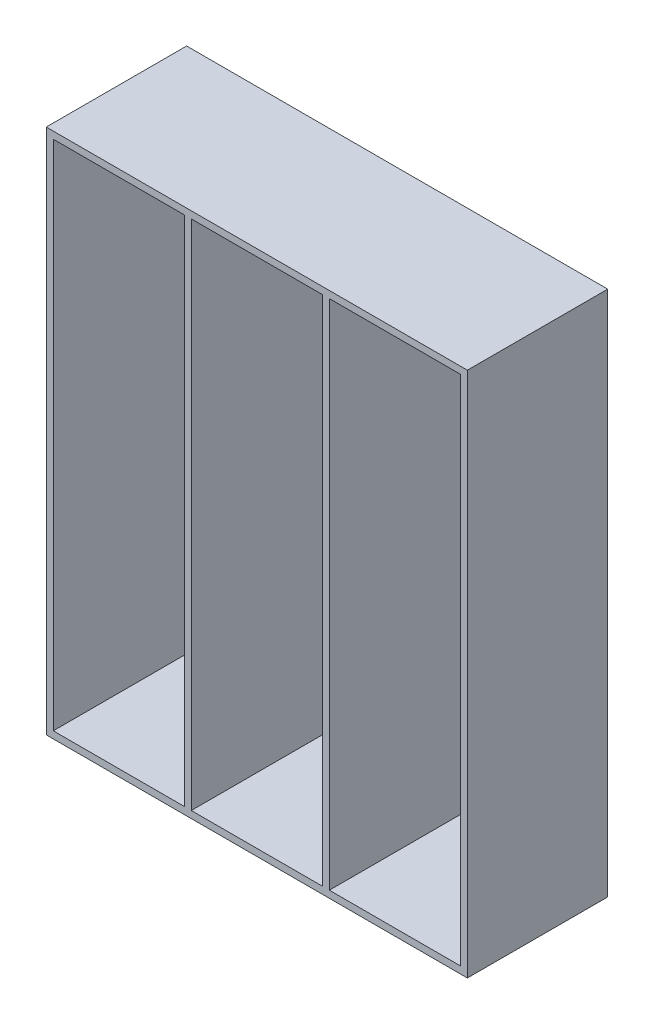
ISO-10303-21;
HEADER;
FILE_DESCRIPTION(('STEP AP214'),'2;1');
FILE_NAME('part.step','',(''),(''),'','','');
FILE_SCHEMA(('AUTOMOTIVE_DESIGN { 1 0 10303 214 1 1 1 1 }'));
ENDSEC;
DATA;
#1=APPLICATION_CONTEXT('core data for automotive mechanical design processes');
#2=APPLICATION_PROTOCOL_DEFINITION('international standard','automotive_design',2000,#1);
#3=PRODUCT_CONTEXT('',#1,'mechanical');
#4=PRODUCT('Part','Part','',(#3));
#5=PRODUCT_RELATED_PRODUCT_CATEGORY('part','',(#4));
#6=PRODUCT_DEFINITION_FORMATION('','',#4);
#7=PRODUCT_DEFINITION_CONTEXT('part definition',#1,'design');
#8=PRODUCT_DEFINITION('design','',#6,#7);
#9=PRODUCT_DEFINITION_SHAPE('','',#8);
#10=(LENGTH_UNIT() NAMED_UNIT(*) SI_UNIT(.MILLI.,.METRE.));
#11=(NAMED_UNIT(*) PLANE_ANGLE_UNIT() SI_UNIT($,.RADIAN.));
#12=(NAMED_UNIT(*) SI_UNIT($,.STERADIAN.) SOLID_ANGLE_UNIT());
#13=UNCERTAINTY_MEASURE_WITH_UNIT(LENGTH_MEASURE(1.E-05),#10,'distance_accuracy_value','');
#14=(GEOMETRIC_REPRESENTATION_CONTEXT(3) GLOBAL_UNCERTAINTY_ASSIGNED_CONTEXT((#13)) GLOBAL_UNIT_ASSIGNED_CONTEXT((#10,
#11,#12)) REPRESENTATION_CONTEXT('',''));
#15=CARTESIAN_POINT('',(0.,0.,0.));
#16=DIRECTION('',(0.,0.,1.));
#17=DIRECTION('',(1.,0.,0.));
#18=AXIS2_PLACEMENT_3D('',#15,#16,#17);
#19=CARTESIAN_POINT('',(30.,-37.5,-20.));
#20=DIRECTION('',(1.,0.,0.));
#21=DIRECTION('',(0.,0.,-1.));
#22=AXIS2_PLACEMENT_3D('',#19,#20,#21);
#23=PLANE('',#22);
#24=DIRECTION('',(0.,1.,0.));
#25=VECTOR('',#24,1.);
#26=CARTESIAN_POINT('',(30.,-37.5,0.));
#27=LINE('',#26,#25);
#28=CARTESIAN_POINT('',(30.,-37.5,0.));
#29=VERTEX_POINT('',#28);
#30=CARTESIAN_POINT('',(30.,37.5,0.));
#31=VERTEX_POINT('',#30);
#32=EDGE_CURVE('E246',#29,#31,#27,.T.);
#33=ORIENTED_EDGE('',*,*,#32,.F.);
#34=DIRECTION('',(0.,0.,1.));
#35=VECTOR('',#34,1.);
#36=CARTESIAN_POINT('',(30.,-37.5,-20.));
#37=LINE('',#36,#35);
#38=CARTESIAN_POINT('',(30.,-37.5,-20.));
#39=VERTEX_POINT('',#38);
#40=EDGE_CURVE('E11',#39,#29,#37,.T.);
#41=ORIENTED_EDGE('',*,*,#40,.F.);
#42=DIRECTION('',(0.,1.,0.));
#43=VECTOR('',#42,1.);
#44=CARTESIAN_POINT('',(30.,-37.5,-20.));
#45=LINE('',#44,#43);
#46=CARTESIAN_POINT('',(30.,37.5,-20.));
#47=VERTEX_POINT('',#46);
#48=EDGE_CURVE('E251',#39,#47,#45,.T.);
#49=ORIENTED_EDGE('',*,*,#48,.T.);
#50=DIRECTION('',(0.,0.,1.));
#51=VECTOR('',#50,1.);
#52=CARTESIAN_POINT('',(30.,37.5,-20.));
#53=LINE('',#52,#51);
#54=EDGE_CURVE('E45',#47,#31,#53,.T.);
#55=ORIENTED_EDGE('',*,*,#54,.T.);
#56=EDGE_LOOP('',(#33,#41,#49,#55));
#57=FACE_BOUND('',#56,.T.);
#58=ADVANCED_FACE('F39',(#57),#23,.T.);
#59=CARTESIAN_POINT('',(-30.,-37.5,-20.));
#60=DIRECTION('',(0.,-1.,0.));
#61=DIRECTION('',(0.,0.,-1.));
#62=AXIS2_PLACEMENT_3D('',#59,#60,#61);
#63=PLANE('',#62);
#64=DIRECTION('',(1.,0.,0.));
#65=VECTOR('',#64,1.);
#66=CARTESIAN_POINT('',(-30.,-37.5,0.));
#67=LINE('',#66,#65);
#68=CARTESIAN_POINT('',(-30.,-37.5,0.));
#69=VERTEX_POINT('',#68);
#70=EDGE_CURVE('E260',#69,#29,#67,.T.);
#71=ORIENTED_EDGE('',*,*,#70,.F.);
#72=DIRECTION('',(0.,0.,1.));
#73=VECTOR('',#72,1.);
#74=CARTESIAN_POINT('',(-30.,-37.5,-20.));
#75=LINE('',#74,#73);
#76=CARTESIAN_POINT('',(-30.,-37.5,-20.));
#77=VERTEX_POINT('',#76);
#78=EDGE_CURVE('E50',#77,#69,#75,.T.);
#79=ORIENTED_EDGE('',*,*,#78,.F.);
#80=DIRECTION('',(1.,0.,0.));
#81=VECTOR('',#80,1.);
#82=CARTESIAN_POINT('',(-30.,-37.5,-20.));
#83=LINE('',#82,#81);
#84=EDGE_CURVE('E263',#77,#39,#83,.T.);
#85=ORIENTED_EDGE('',*,*,#84,.T.);
#86=ORIENTED_EDGE('',*,*,#40,.T.);
#87=EDGE_LOOP('',(#71,#79,#85,#86));
#88=FACE_BOUND('',#87,.T.);
#89=ADVANCED_FACE('F288',(#88),#63,.T.);
#90=CARTESIAN_POINT('',(-30.,-37.5,-20.));
#91=DIRECTION('',(-1.,0.,0.));
#92=DIRECTION('',(0.,0.,1.));
#93=AXIS2_PLACEMENT_3D('',#90,#91,#92);
#94=PLANE('',#93);
#95=DIRECTION('',(0.,-1.,0.));
#96=VECTOR('',#95,1.);
#97=CARTESIAN_POINT('',(-30.,-37.5,0.));
#98=LINE('',#97,#96);
#99=CARTESIAN_POINT('',(-30.,37.5,0.));
#100=VERTEX_POINT('',#99);
#101=EDGE_CURVE('E271',#100,#69,#98,.T.);
#102=ORIENTED_EDGE('',*,*,#101,.F.);
#103=DIRECTION('',(0.,0.,1.));
#104=VECTOR('',#103,1.);
#105=CARTESIAN_POINT('',(-30.,37.5,-20.));
#106=LINE('',#105,#104);
#107=CARTESIAN_POINT('',(-30.,37.5,-20.));
#108=VERTEX_POINT('',#107);
#109=EDGE_CURVE('E277',#108,#100,#106,.T.);
#110=ORIENTED_EDGE('',*,*,#109,.F.);
#111=DIRECTION('',(0.,-1.,0.));
#112=VECTOR('',#111,1.);
#113=CARTESIAN_POINT('',(-30.,-37.5,-20.));
#114=LINE('',#113,#112);
#115=EDGE_CURVE('E257',#108,#77,#114,.T.);
#116=ORIENTED_EDGE('',*,*,#115,.T.);
#117=ORIENTED_EDGE('',*,*,#78,.T.);
#118=EDGE_LOOP('',(#102,#110,#116,#117));
#119=FACE_BOUND('',#118,.T.);
#120=ADVANCED_FACE('F293',(#119),#94,.T.);
#121=CARTESIAN_POINT('',(-30.,37.5,-20.));
#122=DIRECTION('',(0.,1.,0.));
#123=DIRECTION('',(0.,0.,1.));
#124=AXIS2_PLACEMENT_3D('',#121,#122,#123);
#125=PLANE('',#124);
#126=DIRECTION('',(-1.,0.,0.));
#127=VECTOR('',#126,1.);
#128=CARTESIAN_POINT('',(-30.,37.5,0.));
#129=LINE('',#128,#127);
#130=EDGE_CURVE('E268',#31,#100,#129,.T.);
#131=ORIENTED_EDGE('',*,*,#130,.F.);
#132=ORIENTED_EDGE('',*,*,#54,.F.);
#133=DIRECTION('',(-1.,0.,0.));
#134=VECTOR('',#133,1.);
#135=CARTESIAN_POINT('',(-30.,37.5,-20.));
#136=LINE('',#135,#134);
#137=EDGE_CURVE('E258',#47,#108,#136,.T.);
#138=ORIENTED_EDGE('',*,*,#137,.T.);
#139=ORIENTED_EDGE('',*,*,#109,.T.);
#140=EDGE_LOOP('',(#131,#132,#138,#139));
#141=FACE_BOUND('',#140,.T.);
#142=ADVANCED_FACE('F283',(#141),#125,.T.);
#143=CARTESIAN_POINT('',(0.,0.,-20.));
#144=DIRECTION('',(0.,0.,-1.));
#145=DIRECTION('',(-1.,0.,0.));
#146=AXIS2_PLACEMENT_3D('',#143,#144,#145);
#147=PLANE('',#146);
#148=ORIENTED_EDGE('',*,*,#48,.F.);
#149=ORIENTED_EDGE('',*,*,#84,.F.);
#150=ORIENTED_EDGE('',*,*,#115,.F.);
#151=ORIENTED_EDGE('',*,*,#137,.F.);
#152=EDGE_LOOP('',(#148,#149,#150,#151));
#153=FACE_BOUND('',#152,.T.);
#154=ADVANCED_FACE('F295',(#153),#147,.T.);
#155=CARTESIAN_POINT('',(0.,0.,0.));
#156=DIRECTION('',(0.,0.,-1.));
#157=DIRECTION('',(-1.,0.,0.));
#158=AXIS2_PLACEMENT_3D('',#155,#156,#157);
#159=PLANE('',#158);
#160=DIRECTION('',(-1.,0.,0.));
#161=VECTOR('',#160,1.);
#162=CARTESIAN_POINT('',(10.3333333333333,36.5,0.));
#163=LINE('',#162,#161);
#164=CARTESIAN_POINT('',(29.,36.5,0.));
#165=VERTEX_POINT('',#164);
#166=CARTESIAN_POINT('',(10.3333333333333,36.5,0.));
#167=VERTEX_POINT('',#166);
#168=EDGE_CURVE('E182',#165,#167,#163,.T.);
#169=ORIENTED_EDGE('',*,*,#168,.F.);
#170=DIRECTION('',(0.,1.,0.));
#171=VECTOR('',#170,1.);
#172=CARTESIAN_POINT('',(29.,-36.5,0.));
#173=LINE('',#172,#171);
#174=CARTESIAN_POINT('',(29.,-36.5,0.));
#175=VERTEX_POINT('',#174);
#176=EDGE_CURVE('E54',#175,#165,#173,.T.);
#177=ORIENTED_EDGE('',*,*,#176,.F.);
#178=DIRECTION('',(1.,0.,0.));
#179=VECTOR('',#178,1.);
#180=CARTESIAN_POINT('',(10.3333333333333,-36.5,0.));
#181=LINE('',#180,#179);
#182=CARTESIAN_POINT('',(10.3333333333333,-36.5,0.));
#183=VERTEX_POINT('',#182);
#184=EDGE_CURVE('E171',#183,#175,#181,.T.);
#185=ORIENTED_EDGE('',*,*,#184,.F.);
#186=DIRECTION('',(0.,-1.,0.));
#187=VECTOR('',#186,1.);
#188=CARTESIAN_POINT('',(10.3333333333333,-36.5,0.));
#189=LINE('',#188,#187);
#190=EDGE_CURVE('E172',#167,#183,#189,.T.);
#191=ORIENTED_EDGE('',*,*,#190,.F.);
#192=EDGE_LOOP('',(#169,#177,#185,#191));
#193=FACE_BOUND('',#192,.T.);
#194=DIRECTION('',(-1.,0.,0.));
#195=VECTOR('',#194,1.);
#196=CARTESIAN_POINT('',(-9.33333333333333,36.5,0.));
#197=LINE('',#196,#195);
#198=CARTESIAN_POINT('',(9.33333333333333,36.5,0.));
#199=VERTEX_POINT('',#198);
#200=CARTESIAN_POINT('',(-9.33333333333333,36.5,0.));
#201=VERTEX_POINT('',#200);
#202=EDGE_CURVE('E202',#199,#201,#197,.T.);
#203=ORIENTED_EDGE('',*,*,#202,.F.);
#204=DIRECTION('',(0.,1.,0.));
#205=VECTOR('',#204,1.);
#206=CARTESIAN_POINT('',(9.33333333333333,-36.5,0.));
#207=LINE('',#206,#205);
#208=CARTESIAN_POINT('',(9.33333333333333,-36.5,0.));
#209=VERTEX_POINT('',#208);
#210=EDGE_CURVE('E65',#209,#199,#207,.T.);
#211=ORIENTED_EDGE('',*,*,#210,.F.);
#212=DIRECTION('',(1.,0.,0.));
#213=VECTOR('',#212,1.);
#214=CARTESIAN_POINT('',(-9.33333333333333,-36.5,0.));
#215=LINE('',#214,#213);
#216=CARTESIAN_POINT('',(-9.33333333333333,-36.5,0.));
#217=VERTEX_POINT('',#216);
#218=EDGE_CURVE('E193',#217,#209,#215,.T.);
#219=ORIENTED_EDGE('',*,*,#218,.F.);
#220=DIRECTION('',(0.,-1.,0.));
#221=VECTOR('',#220,1.);
#222=CARTESIAN_POINT('',(-9.33333333333333,-36.5,0.));
#223=LINE('',#222,#221);
#224=EDGE_CURVE('E208',#201,#217,#223,.T.);
#225=ORIENTED_EDGE('',*,*,#224,.F.);
#226=EDGE_LOOP('',(#203,#211,#219,#225));
#227=FACE_BOUND('',#226,.T.);
#228=DIRECTION('',(-1.,0.,0.));
#229=VECTOR('',#228,1.);
#230=CARTESIAN_POINT('',(-29.,36.5,0.));
#231=LINE('',#230,#229);
#232=CARTESIAN_POINT('',(-10.3333333333333,36.5,0.));
#233=VERTEX_POINT('',#232);
#234=CARTESIAN_POINT('',(-29.,36.5,0.));
#235=VERTEX_POINT('',#234);
#236=EDGE_CURVE('E237',#233,#235,#231,.T.);
#237=ORIENTED_EDGE('',*,*,#236,.F.);
#238=DIRECTION('',(0.,1.,0.));
#239=VECTOR('',#238,1.);
#240=CARTESIAN_POINT('',(-10.3333333333333,-36.5,0.));
#241=LINE('',#240,#239);
#242=CARTESIAN_POINT('',(-10.3333333333333,-36.5,0.));
#243=VERTEX_POINT('',#242);
#244=EDGE_CURVE('E214',#243,#233,#241,.T.);
#245=ORIENTED_EDGE('',*,*,#244,.F.);
#246=DIRECTION('',(1.,0.,0.));
#247=VECTOR('',#246,1.);
#248=CARTESIAN_POINT('',(-29.,-36.5,0.));
#249=LINE('',#248,#247);
#250=CARTESIAN_POINT('',(-29.,-36.5,0.));
#251=VERTEX_POINT('',#250);
#252=EDGE_CURVE('E223',#251,#243,#249,.T.);
#253=ORIENTED_EDGE('',*,*,#252,.F.);
#254=DIRECTION('',(0.,-1.,0.));
#255=VECTOR('',#254,1.);
#256=CARTESIAN_POINT('',(-29.,-36.5,0.));
#257=LINE('',#256,#255);
#258=EDGE_CURVE('E239',#235,#251,#257,.T.);
#259=ORIENTED_EDGE('',*,*,#258,.F.);
#260=EDGE_LOOP('',(#237,#245,#253,#259));
#261=FACE_BOUND('',#260,.T.);
#262=ORIENTED_EDGE('',*,*,#32,.T.);
#263=ORIENTED_EDGE('',*,*,#130,.T.);
#264=ORIENTED_EDGE('',*,*,#101,.T.);
#265=ORIENTED_EDGE('',*,*,#70,.T.);
#266=EDGE_LOOP('',(#262,#263,#264,#265));
#267=FACE_BOUND('',#266,.T.);
#268=ADVANCED_FACE('F286',(#193,#227,#261,#267),#159,.F.);
#269=CARTESIAN_POINT('',(-10.3333333333333,-36.5,-19.));
#270=DIRECTION('',(1.,0.,0.));
#271=DIRECTION('',(0.,0.,-1.));
#272=AXIS2_PLACEMENT_3D('',#269,#270,#271);
#273=PLANE('',#272);
#274=ORIENTED_EDGE('',*,*,#244,.T.);
#275=DIRECTION('',(0.,0.,1.));
#276=VECTOR('',#275,1.);
#277=CARTESIAN_POINT('',(-10.3333333333333,36.5,-19.));
#278=LINE('',#277,#276);
#279=CARTESIAN_POINT('',(-10.3333333333333,36.5,-19.));
#280=VERTEX_POINT('',#279);
#281=EDGE_CURVE('E233',#280,#233,#278,.T.);
#282=ORIENTED_EDGE('',*,*,#281,.F.);
#283=DIRECTION('',(0.,1.,0.));
#284=VECTOR('',#283,1.);
#285=CARTESIAN_POINT('',(-10.3333333333333,-36.5,-19.));
#286=LINE('',#285,#284);
#287=CARTESIAN_POINT('',(-10.3333333333333,-36.5,-19.));
#288=VERTEX_POINT('',#287);
#289=EDGE_CURVE('E222',#288,#280,#286,.T.);
#290=ORIENTED_EDGE('',*,*,#289,.F.);
#291=DIRECTION('',(0.,0.,1.));
#292=VECTOR('',#291,1.);
#293=CARTESIAN_POINT('',(-10.3333333333333,-36.5,-19.));
#294=LINE('',#293,#292);
#295=EDGE_CURVE('E243',#288,#243,#294,.T.);
#296=ORIENTED_EDGE('',*,*,#295,.T.);
#297=EDGE_LOOP('',(#274,#282,#290,#296));
#298=FACE_BOUND('',#297,.T.);
#299=ADVANCED_FACE('F337',(#298),#273,.F.);
#300=CARTESIAN_POINT('',(-29.,-36.5,-19.));
#301=DIRECTION('',(0.,-1.,0.));
#302=DIRECTION('',(0.,0.,-1.));
#303=AXIS2_PLACEMENT_3D('',#300,#301,#302);
#304=PLANE('',#303);
#305=ORIENTED_EDGE('',*,*,#252,.T.);
#306=ORIENTED_EDGE('',*,*,#295,.F.);
#307=DIRECTION('',(1.,0.,0.));
#308=VECTOR('',#307,1.);
#309=CARTESIAN_POINT('',(-29.,-36.5,-19.));
#310=LINE('',#309,#308);
#311=CARTESIAN_POINT('',(-29.,-36.5,-19.));
#312=VERTEX_POINT('',#311);
#313=EDGE_CURVE('E231',#312,#288,#310,.T.);
#314=ORIENTED_EDGE('',*,*,#313,.F.);
#315=DIRECTION('',(0.,0.,1.));
#316=VECTOR('',#315,1.);
#317=CARTESIAN_POINT('',(-29.,-36.5,-19.));
#318=LINE('',#317,#316);
#319=EDGE_CURVE('E247',#312,#251,#318,.T.);
#320=ORIENTED_EDGE('',*,*,#319,.T.);
#321=EDGE_LOOP('',(#305,#306,#314,#320));
#322=FACE_BOUND('',#321,.T.);
#323=ADVANCED_FACE('F354',(#322),#304,.F.);
#324=CARTESIAN_POINT('',(-29.,-36.5,-19.));
#325=DIRECTION('',(-1.,0.,0.));
#326=DIRECTION('',(0.,0.,1.));
#327=AXIS2_PLACEMENT_3D('',#324,#325,#326);
#328=PLANE('',#327);
#329=ORIENTED_EDGE('',*,*,#258,.T.);
#330=ORIENTED_EDGE('',*,*,#319,.F.);
#331=DIRECTION('',(0.,-1.,0.));
#332=VECTOR('',#331,1.);
#333=CARTESIAN_POINT('',(-29.,-36.5,-19.));
#334=LINE('',#333,#332);
#335=CARTESIAN_POINT('',(-29.,36.5,-19.));
#336=VERTEX_POINT('',#335);
#337=EDGE_CURVE('E230',#336,#312,#334,.T.);
#338=ORIENTED_EDGE('',*,*,#337,.F.);
#339=DIRECTION('',(0.,0.,1.));
#340=VECTOR('',#339,1.);
#341=CARTESIAN_POINT('',(-29.,36.5,-19.));
#342=LINE('',#341,#340);
#343=EDGE_CURVE('E248',#336,#235,#342,.T.);
#344=ORIENTED_EDGE('',*,*,#343,.T.);
#345=EDGE_LOOP('',(#329,#330,#338,#344));
#346=FACE_BOUND('',#345,.T.);
#347=ADVANCED_FACE('F363',(#346),#328,.F.);
#348=CARTESIAN_POINT('',(-29.,36.5,-19.));
#349=DIRECTION('',(0.,1.,0.));
#350=DIRECTION('',(0.,0.,1.));
#351=AXIS2_PLACEMENT_3D('',#348,#349,#350);
#352=PLANE('',#351);
#353=ORIENTED_EDGE('',*,*,#236,.T.);
#354=ORIENTED_EDGE('',*,*,#343,.F.);
#355=DIRECTION('',(-1.,0.,0.));
#356=VECTOR('',#355,1.);
#357=CARTESIAN_POINT('',(-29.,36.5,-19.));
#358=LINE('',#357,#356);
#359=EDGE_CURVE('E221',#280,#336,#358,.T.);
#360=ORIENTED_EDGE('',*,*,#359,.F.);
#361=ORIENTED_EDGE('',*,*,#281,.T.);
#362=EDGE_LOOP('',(#353,#354,#360,#361));
#363=FACE_BOUND('',#362,.T.);
#364=ADVANCED_FACE('F371',(#363),#352,.F.);
#365=CARTESIAN_POINT('',(0.,0.,-19.));
#366=DIRECTION('',(0.,0.,-1.));
#367=DIRECTION('',(-1.,0.,0.));
#368=AXIS2_PLACEMENT_3D('',#365,#366,#367);
#369=PLANE('',#368);
#370=ORIENTED_EDGE('',*,*,#289,.T.);
#371=ORIENTED_EDGE('',*,*,#359,.T.);
#372=ORIENTED_EDGE('',*,*,#337,.T.);
#373=ORIENTED_EDGE('',*,*,#313,.T.);
#374=EDGE_LOOP('',(#370,#371,#372,#373));
#375=FACE_BOUND('',#374,.T.);
#376=ADVANCED_FACE('F381',(#375),#369,.F.);
#377=CARTESIAN_POINT('',(9.33333333333333,-36.5,-19.));
#378=DIRECTION('',(1.,0.,0.));
#379=DIRECTION('',(0.,0.,-1.));
#380=AXIS2_PLACEMENT_3D('',#377,#378,#379);
#381=PLANE('',#380);
#382=ORIENTED_EDGE('',*,*,#210,.T.);
#383=DIRECTION('',(0.,0.,1.));
#384=VECTOR('',#383,1.);
#385=CARTESIAN_POINT('',(9.33333333333333,36.5,-19.));
#386=LINE('',#385,#384);
#387=CARTESIAN_POINT('',(9.33333333333333,36.5,-19.));
#388=VERTEX_POINT('',#387);
#389=EDGE_CURVE('E201',#388,#199,#386,.T.);
#390=ORIENTED_EDGE('',*,*,#389,.F.);
#391=DIRECTION('',(0.,1.,0.));
#392=VECTOR('',#391,1.);
#393=CARTESIAN_POINT('',(9.33333333333333,-36.5,-19.));
#394=LINE('',#393,#392);
#395=CARTESIAN_POINT('',(9.33333333333333,-36.5,-19.));
#396=VERTEX_POINT('',#395);
#397=EDGE_CURVE('E187',#396,#388,#394,.T.);
#398=ORIENTED_EDGE('',*,*,#397,.F.);
#399=DIRECTION('',(0.,0.,1.));
#400=VECTOR('',#399,1.);
#401=CARTESIAN_POINT('',(9.33333333333333,-36.5,-19.));
#402=LINE('',#401,#400);
#403=EDGE_CURVE('E213',#396,#209,#402,.T.);
#404=ORIENTED_EDGE('',*,*,#403,.T.);
#405=EDGE_LOOP('',(#382,#390,#398,#404));
#406=FACE_BOUND('',#405,.T.);
#407=ADVANCED_FACE('F394',(#406),#381,.F.);
#408=CARTESIAN_POINT('',(-9.33333333333333,-36.5,-19.));
#409=DIRECTION('',(0.,-1.,0.));
#410=DIRECTION('',(0.,0.,-1.));
#411=AXIS2_PLACEMENT_3D('',#408,#409,#410);
#412=PLANE('',#411);
#413=ORIENTED_EDGE('',*,*,#218,.T.);
#414=ORIENTED_EDGE('',*,*,#403,.F.);
#415=DIRECTION('',(1.,0.,0.));
#416=VECTOR('',#415,1.);
#417=CARTESIAN_POINT('',(-9.33333333333333,-36.5,-19.));
#418=LINE('',#417,#416);
#419=CARTESIAN_POINT('',(-9.33333333333333,-36.5,-19.));
#420=VERTEX_POINT('',#419);
#421=EDGE_CURVE('E199',#420,#396,#418,.T.);
#422=ORIENTED_EDGE('',*,*,#421,.F.);
#423=DIRECTION('',(0.,0.,1.));
#424=VECTOR('',#423,1.);
#425=CARTESIAN_POINT('',(-9.33333333333333,-36.5,-19.));
#426=LINE('',#425,#424);
#427=EDGE_CURVE('E216',#420,#217,#426,.T.);
#428=ORIENTED_EDGE('',*,*,#427,.T.);
#429=EDGE_LOOP('',(#413,#414,#422,#428));
#430=FACE_BOUND('',#429,.T.);
#431=ADVANCED_FACE('F402',(#430),#412,.F.);
#432=CARTESIAN_POINT('',(-9.33333333333333,-36.5,-19.));
#433=DIRECTION('',(-1.,0.,0.));
#434=DIRECTION('',(0.,0.,1.));
#435=AXIS2_PLACEMENT_3D('',#432,#433,#434);
#436=PLANE('',#435);
#437=ORIENTED_EDGE('',*,*,#224,.T.);
#438=ORIENTED_EDGE('',*,*,#427,.F.);
#439=DIRECTION('',(0.,-1.,0.));
#440=VECTOR('',#439,1.);
#441=CARTESIAN_POINT('',(-9.33333333333333,-36.5,-19.));
#442=LINE('',#441,#440);
#443=CARTESIAN_POINT('',(-9.33333333333333,36.5,-19.));
#444=VERTEX_POINT('',#443);
#445=EDGE_CURVE('E197',#444,#420,#442,.T.);
#446=ORIENTED_EDGE('',*,*,#445,.F.);
#447=DIRECTION('',(0.,0.,1.));
#448=VECTOR('',#447,1.);
#449=CARTESIAN_POINT('',(-9.33333333333333,36.5,-19.));
#450=LINE('',#449,#448);
#451=EDGE_CURVE('E217',#444,#201,#450,.T.);
#452=ORIENTED_EDGE('',*,*,#451,.T.);
#453=EDGE_LOOP('',(#437,#438,#446,#452));
#454=FACE_BOUND('',#453,.T.);
#455=ADVANCED_FACE('F407',(#454),#436,.F.);
#456=CARTESIAN_POINT('',(-9.33333333333333,36.5,-19.));
#457=DIRECTION('',(0.,1.,0.));
#458=DIRECTION('',(0.,0.,1.));
#459=AXIS2_PLACEMENT_3D('',#456,#457,#458);
#460=PLANE('',#459);
#461=ORIENTED_EDGE('',*,*,#202,.T.);
#462=ORIENTED_EDGE('',*,*,#451,.F.);
#463=DIRECTION('',(-1.,0.,0.));
#464=VECTOR('',#463,1.);
#465=CARTESIAN_POINT('',(-9.33333333333333,36.5,-19.));
#466=LINE('',#465,#464);
#467=EDGE_CURVE('E194',#388,#444,#466,.T.);
#468=ORIENTED_EDGE('',*,*,#467,.F.);
#469=ORIENTED_EDGE('',*,*,#389,.T.);
#470=EDGE_LOOP('',(#461,#462,#468,#469));
#471=FACE_BOUND('',#470,.T.);
#472=ADVANCED_FACE('F419',(#471),#460,.F.);
#473=CARTESIAN_POINT('',(0.,0.,-19.));
#474=DIRECTION('',(0.,0.,-1.));
#475=DIRECTION('',(-1.,0.,0.));
#476=AXIS2_PLACEMENT_3D('',#473,#474,#475);
#477=PLANE('',#476);
#478=ORIENTED_EDGE('',*,*,#397,.T.);
#479=ORIENTED_EDGE('',*,*,#467,.T.);
#480=ORIENTED_EDGE('',*,*,#445,.T.);
#481=ORIENTED_EDGE('',*,*,#421,.T.);
#482=EDGE_LOOP('',(#478,#479,#480,#481));
#483=FACE_BOUND('',#482,.T.);
#484=ADVANCED_FACE('F429',(#483),#477,.F.);
#485=CARTESIAN_POINT('',(29.,-36.5,-19.));
#486=DIRECTION('',(1.,0.,0.));
#487=DIRECTION('',(0.,0.,-1.));
#488=AXIS2_PLACEMENT_3D('',#485,#486,#487);
#489=PLANE('',#488);
#490=ORIENTED_EDGE('',*,*,#176,.T.);
#491=DIRECTION('',(0.,0.,1.));
#492=VECTOR('',#491,1.);
#493=CARTESIAN_POINT('',(29.,36.5,-19.));
#494=LINE('',#493,#492);
#495=CARTESIAN_POINT('',(29.,36.5,-19.));
#496=VERTEX_POINT('',#495);
#497=EDGE_CURVE('E147',#496,#165,#494,.T.);
#498=ORIENTED_EDGE('',*,*,#497,.F.);
#499=DIRECTION('',(0.,1.,0.));
#500=VECTOR('',#499,1.);
#501=CARTESIAN_POINT('',(29.,-36.5,-19.));
#502=LINE('',#501,#500);
#503=CARTESIAN_POINT('',(29.,-36.5,-19.));
#504=VERTEX_POINT('',#503);
#505=EDGE_CURVE('E152',#504,#496,#502,.T.);
#506=ORIENTED_EDGE('',*,*,#505,.F.);
#507=DIRECTION('',(0.,0.,1.));
#508=VECTOR('',#507,1.);
#509=CARTESIAN_POINT('',(29.,-36.5,-19.));
#510=LINE('',#509,#508);
#511=EDGE_CURVE('E183',#504,#175,#510,.T.);
#512=ORIENTED_EDGE('',*,*,#511,.T.);
#513=EDGE_LOOP('',(#490,#498,#506,#512));
#514=FACE_BOUND('',#513,.T.);
#515=ADVANCED_FACE('F155',(#514),#489,.F.);
#516=CARTESIAN_POINT('',(10.3333333333333,-36.5,-19.));
#517=DIRECTION('',(0.,-1.,0.));
#518=DIRECTION('',(0.,0.,-1.));
#519=AXIS2_PLACEMENT_3D('',#516,#517,#518);
#520=PLANE('',#519);
#521=ORIENTED_EDGE('',*,*,#184,.T.);
#522=ORIENTED_EDGE('',*,*,#511,.F.);
#523=DIRECTION('',(1.,0.,0.));
#524=VECTOR('',#523,1.);
#525=CARTESIAN_POINT('',(10.3333333333333,-36.5,-19.));
#526=LINE('',#525,#524);
#527=CARTESIAN_POINT('',(10.3333333333333,-36.5,-19.));
#528=VERTEX_POINT('',#527);
#529=EDGE_CURVE('E159',#528,#504,#526,.T.);
#530=ORIENTED_EDGE('',*,*,#529,.F.);
#531=DIRECTION('',(0.,0.,1.));
#532=VECTOR('',#531,1.);
#533=CARTESIAN_POINT('',(10.3333333333333,-36.5,-19.));
#534=LINE('',#533,#532);
#535=EDGE_CURVE('E186',#528,#183,#534,.T.);
#536=ORIENTED_EDGE('',*,*,#535,.T.);
#537=EDGE_LOOP('',(#521,#522,#530,#536));
#538=FACE_BOUND('',#537,.T.);
#539=ADVANCED_FACE('F446',(#538),#520,.F.);
#540=CARTESIAN_POINT('',(10.3333333333333,-36.5,-19.));
#541=DIRECTION('',(-1.,0.,0.));
#542=DIRECTION('',(0.,0.,1.));
#543=AXIS2_PLACEMENT_3D('',#540,#541,#542);
#544=PLANE('',#543);
#545=ORIENTED_EDGE('',*,*,#190,.T.);
#546=ORIENTED_EDGE('',*,*,#535,.F.);
#547=DIRECTION('',(0.,-1.,0.));
#548=VECTOR('',#547,1.);
#549=CARTESIAN_POINT('',(10.3333333333333,-36.5,-19.));
#550=LINE('',#549,#548);
#551=CARTESIAN_POINT('',(10.3333333333333,36.5,-19.));
#552=VERTEX_POINT('',#551);
#553=EDGE_CURVE('E169',#552,#528,#550,.T.);
#554=ORIENTED_EDGE('',*,*,#553,.F.);
#555=DIRECTION('',(0.,0.,1.));
#556=VECTOR('',#555,1.);
#557=CARTESIAN_POINT('',(10.3333333333333,36.5,-19.));
#558=LINE('',#557,#556);
#559=EDGE_CURVE('E157',#552,#167,#558,.T.);
#560=ORIENTED_EDGE('',*,*,#559,.T.);
#561=EDGE_LOOP('',(#545,#546,#554,#560));
#562=FACE_BOUND('',#561,.T.);
#563=ADVANCED_FACE('F457',(#562),#544,.F.);
#564=CARTESIAN_POINT('',(10.3333333333333,36.5,-19.));
#565=DIRECTION('',(0.,1.,0.));
#566=DIRECTION('',(0.,0.,1.));
#567=AXIS2_PLACEMENT_3D('',#564,#565,#566);
#568=PLANE('',#567);
#569=ORIENTED_EDGE('',*,*,#168,.T.);
#570=ORIENTED_EDGE('',*,*,#559,.F.);
#571=DIRECTION('',(-1.,0.,0.));
#572=VECTOR('',#571,1.);
#573=CARTESIAN_POINT('',(10.3333333333333,36.5,-19.));
#574=LINE('',#573,#572);
#575=EDGE_CURVE('E162',#496,#552,#574,.T.);
#576=ORIENTED_EDGE('',*,*,#575,.F.);
#577=ORIENTED_EDGE('',*,*,#497,.T.);
#578=EDGE_LOOP('',(#569,#570,#576,#577));
#579=FACE_BOUND('',#578,.T.);
#580=ADVANCED_FACE('F163',(#579),#568,.F.);
#581=CARTESIAN_POINT('',(0.,0.,-19.));
#582=DIRECTION('',(0.,0.,-1.));
#583=DIRECTION('',(-1.,0.,0.));
#584=AXIS2_PLACEMENT_3D('',#581,#582,#583);
#585=PLANE('',#584);
#586=ORIENTED_EDGE('',*,*,#505,.T.);
#587=ORIENTED_EDGE('',*,*,#575,.T.);
#588=ORIENTED_EDGE('',*,*,#553,.T.);
#589=ORIENTED_EDGE('',*,*,#529,.T.);
#590=EDGE_LOOP('',(#586,#587,#588,#589));
#591=FACE_BOUND('',#590,.T.);
#592=ADVANCED_FACE('F168',(#591),#585,.F.);
#593=CLOSED_SHELL('',(#58,#89,#120,#142,#154,#268,#299,#323,#347,#364,#376,#407,#431,#455,#472,
#484,#515,#539,#563,#580,#592));
#594=MANIFOLD_SOLID_BREP('B2',#593);
#595=ADVANCED_BREP_SHAPE_REPRESENTATION('',(#18,#594),#14);
#596=SHAPE_DEFINITION_REPRESENTATION(#9,#595);
ENDSEC;
END-ISO-10303-21;
